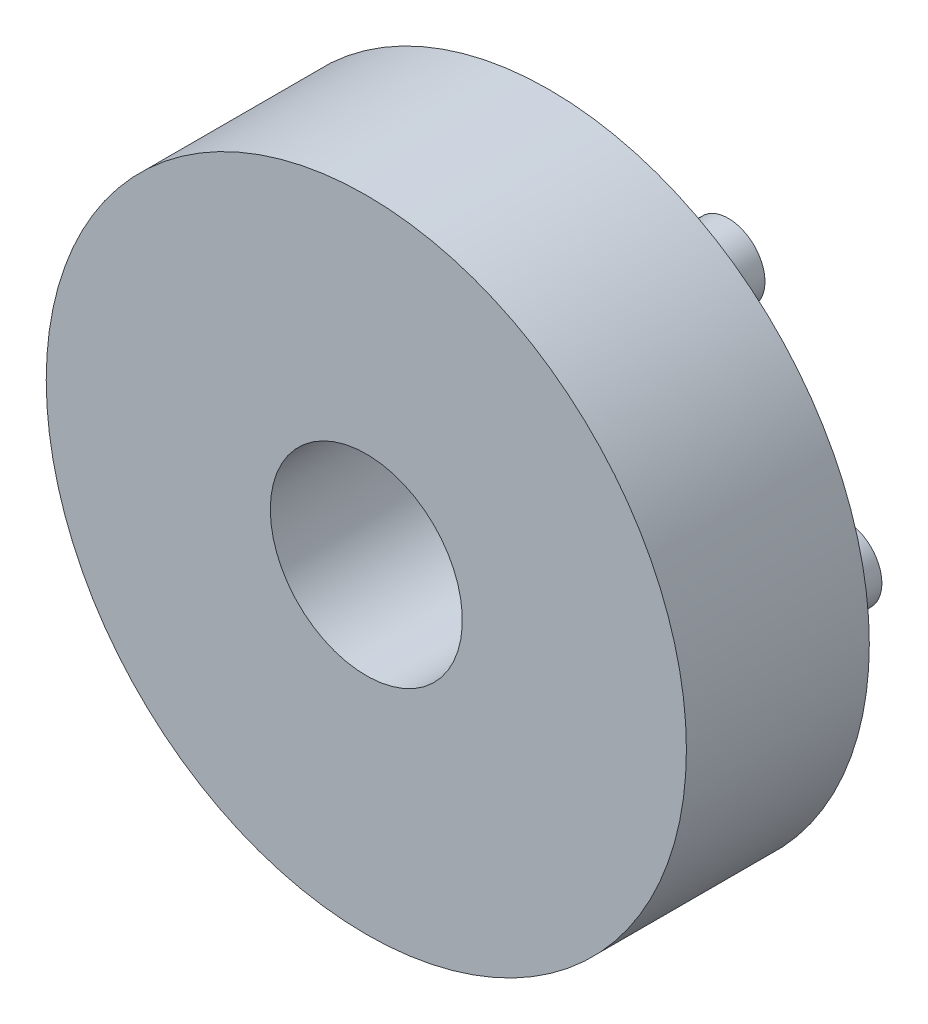
ISO-10303-21;
HEADER;
FILE_DESCRIPTION(('STEP AP214'),'2;1');
FILE_NAME('part.step','',(''),(''),'','','');
FILE_SCHEMA(('AUTOMOTIVE_DESIGN { 1 0 10303 214 1 1 1 1 }'));
ENDSEC;
DATA;
#1=APPLICATION_CONTEXT('core data for automotive mechanical design processes');
#2=APPLICATION_PROTOCOL_DEFINITION('international standard','automotive_design',2000,#1);
#3=PRODUCT_CONTEXT('',#1,'mechanical');
#4=PRODUCT('Part','Part','',(#3));
#5=PRODUCT_RELATED_PRODUCT_CATEGORY('part','',(#4));
#6=PRODUCT_DEFINITION_FORMATION('','',#4);
#7=PRODUCT_DEFINITION_CONTEXT('part definition',#1,'design');
#8=PRODUCT_DEFINITION('design','',#6,#7);
#9=PRODUCT_DEFINITION_SHAPE('','',#8);
#10=(LENGTH_UNIT() NAMED_UNIT(*) SI_UNIT(.MILLI.,.METRE.));
#11=(NAMED_UNIT(*) PLANE_ANGLE_UNIT() SI_UNIT($,.RADIAN.));
#12=(NAMED_UNIT(*) SI_UNIT($,.STERADIAN.) SOLID_ANGLE_UNIT());
#13=UNCERTAINTY_MEASURE_WITH_UNIT(LENGTH_MEASURE(1.E-05),#10,'distance_accuracy_value','');
#14=(GEOMETRIC_REPRESENTATION_CONTEXT(3) GLOBAL_UNCERTAINTY_ASSIGNED_CONTEXT((#13)) GLOBAL_UNIT_ASSIGNED_CONTEXT((#10,
#11,#12)) REPRESENTATION_CONTEXT('',''));
#15=CARTESIAN_POINT('',(0.,0.,0.));
#16=DIRECTION('',(0.,0.,1.));
#17=DIRECTION('',(1.,0.,0.));
#18=AXIS2_PLACEMENT_3D('',#15,#16,#17);
#19=CARTESIAN_POINT('',(0.,0.,0.));
#20=DIRECTION('',(0.,0.,1.));
#21=DIRECTION('',(1.,0.,0.));
#22=AXIS2_PLACEMENT_3D('',#19,#20,#21);
#23=PLANE('',#22);
#24=CARTESIAN_POINT('',(12.8293385803761,-23.0417841378882,0.));
#25=DIRECTION('',(0.,0.,-1.));
#26=DIRECTION('',(-1.,0.,0.));
#27=AXIS2_PLACEMENT_3D('',#24,#25,#26);
#28=CIRCLE('',#27,4.00000000000001);
#29=CARTESIAN_POINT('',(8.8293385803761,-23.0417841378882,0.));
#30=VERTEX_POINT('',#29);
#31=EDGE_CURVE('E60',#30,#30,#28,.T.);
#32=ORIENTED_EDGE('',*,*,#31,.F.);
#33=EDGE_LOOP('',(#32));
#34=FACE_BOUND('',#33,.T.);
#35=CARTESIAN_POINT('',(-26.3690966091135,0.431843358408401,0.));
#36=DIRECTION('',(0.,0.,-1.));
#37=DIRECTION('',(-1.,0.,0.));
#38=AXIS2_PLACEMENT_3D('',#35,#36,#37);
#39=CIRCLE('',#38,4.);
#40=CARTESIAN_POINT('',(-30.3690966091135,0.431843358408401,0.));
#41=VERTEX_POINT('',#40);
#42=EDGE_CURVE('E59',#41,#41,#39,.T.);
#43=ORIENTED_EDGE('',*,*,#42,.F.);
#44=EDGE_LOOP('',(#43));
#45=FACE_BOUND('',#44,.T.);
#46=CARTESIAN_POINT('',(13.5889936084931,22.6021016141264,0.));
#47=DIRECTION('',(0.,0.,-1.));
#48=DIRECTION('',(-1.,0.,0.));
#49=AXIS2_PLACEMENT_3D('',#46,#47,#48);
#50=CIRCLE('',#49,4.);
#51=CARTESIAN_POINT('',(9.58899360849312,22.6021016141264,0.));
#52=VERTEX_POINT('',#51);
#53=EDGE_CURVE('E54',#52,#52,#50,.T.);
#54=ORIENTED_EDGE('',*,*,#53,.F.);
#55=EDGE_LOOP('',(#54));
#56=FACE_BOUND('',#55,.T.);
#57=CARTESIAN_POINT('',(0.,0.,0.));
#58=DIRECTION('',(0.,0.,1.));
#59=DIRECTION('',(1.,0.,0.));
#60=AXIS2_PLACEMENT_3D('',#57,#58,#59);
#61=CIRCLE('',#60,35.);
#62=CARTESIAN_POINT('',(35.,0.,0.));
#63=VERTEX_POINT('',#62);
#64=EDGE_CURVE('E45',#63,#63,#61,.T.);
#65=ORIENTED_EDGE('',*,*,#64,.F.);
#66=EDGE_LOOP('',(#65));
#67=FACE_BOUND('',#66,.T.);
#68=CARTESIAN_POINT('',(-13.5889936084931,22.6021016141264,0.));
#69=DIRECTION('',(0.,0.,1.));
#70=DIRECTION('',(1.,0.,0.));
#71=AXIS2_PLACEMENT_3D('',#68,#69,#70);
#72=CIRCLE('',#71,4.);
#73=CARTESIAN_POINT('',(-9.58899360849312,22.6021016141264,0.));
#74=VERTEX_POINT('',#73);
#75=EDGE_CURVE('E71',#74,#74,#72,.T.);
#76=ORIENTED_EDGE('',*,*,#75,.T.);
#77=EDGE_LOOP('',(#76));
#78=FACE_BOUND('',#77,.T.);
#79=CARTESIAN_POINT('',(-12.8416013543717,-23.0349521232922,0.));
#80=DIRECTION('',(0.,0.,1.));
#81=DIRECTION('',(1.,0.,0.));
#82=AXIS2_PLACEMENT_3D('',#79,#80,#81);
#83=CIRCLE('',#82,4.00000000000001);
#84=CARTESIAN_POINT('',(-8.84160135437169,-23.0349521232922,0.));
#85=VERTEX_POINT('',#84);
#86=EDGE_CURVE('E83',#85,#85,#83,.T.);
#87=ORIENTED_EDGE('',*,*,#86,.T.);
#88=EDGE_LOOP('',(#87));
#89=FACE_BOUND('',#88,.T.);
#90=CARTESIAN_POINT('',(26.3690966091135,0.431843358408401,0.));
#91=DIRECTION('',(0.,0.,1.));
#92=DIRECTION('',(1.,0.,0.));
#93=AXIS2_PLACEMENT_3D('',#90,#91,#92);
#94=CIRCLE('',#93,4.);
#95=CARTESIAN_POINT('',(30.3690966091135,0.431843358408401,0.));
#96=VERTEX_POINT('',#95);
#97=EDGE_CURVE('E95',#96,#96,#94,.T.);
#98=ORIENTED_EDGE('',*,*,#97,.T.);
#99=EDGE_LOOP('',(#98));
#100=FACE_BOUND('',#99,.T.);
#101=CARTESIAN_POINT('',(0.,0.,0.));
#102=DIRECTION('',(0.,0.,-1.));
#103=DIRECTION('',(-1.,0.,0.));
#104=AXIS2_PLACEMENT_3D('',#101,#102,#103);
#105=CIRCLE('',#104,10.5);
#106=CARTESIAN_POINT('',(-10.5,0.,0.));
#107=VERTEX_POINT('',#106);
#108=EDGE_CURVE('E104',#107,#107,#105,.T.);
#109=ORIENTED_EDGE('',*,*,#108,.F.);
#110=EDGE_LOOP('',(#109));
#111=FACE_BOUND('',#110,.T.);
#112=ADVANCED_FACE('F41',(#34,#45,#56,#67,#78,#89,#100,#111),#23,.F.);
#113=CARTESIAN_POINT('',(0.,0.,20.));
#114=DIRECTION('',(0.,0.,1.));
#115=DIRECTION('',(1.,0.,0.));
#116=AXIS2_PLACEMENT_3D('',#113,#114,#115);
#117=PLANE('',#116);
#118=CARTESIAN_POINT('',(0.,0.,20.));
#119=DIRECTION('',(0.,0.,1.));
#120=DIRECTION('',(1.,0.,0.));
#121=AXIS2_PLACEMENT_3D('',#118,#119,#120);
#122=CIRCLE('',#121,35.);
#123=CARTESIAN_POINT('',(35.,0.,20.));
#124=VERTEX_POINT('',#123);
#125=EDGE_CURVE('E10',#124,#124,#122,.T.);
#126=ORIENTED_EDGE('',*,*,#125,.T.);
#127=EDGE_LOOP('',(#126));
#128=FACE_BOUND('',#127,.T.);
#129=CARTESIAN_POINT('',(0.,0.,20.));
#130=DIRECTION('',(0.,0.,-1.));
#131=DIRECTION('',(-1.,0.,0.));
#132=AXIS2_PLACEMENT_3D('',#129,#130,#131);
#133=CIRCLE('',#132,10.5);
#134=CARTESIAN_POINT('',(-10.5,0.,20.));
#135=VERTEX_POINT('',#134);
#136=EDGE_CURVE('E103',#135,#135,#133,.T.);
#137=ORIENTED_EDGE('',*,*,#136,.T.);
#138=EDGE_LOOP('',(#137));
#139=FACE_BOUND('',#138,.T.);
#140=ADVANCED_FACE('F112',(#128,#139),#117,.T.);
#141=CARTESIAN_POINT('',(0.,0.,20.));
#142=DIRECTION('',(0.,0.,-1.));
#143=DIRECTION('',(-1.,0.,0.));
#144=AXIS2_PLACEMENT_3D('',#141,#142,#143);
#145=CYLINDRICAL_SURFACE('',#144,35.);
#146=ORIENTED_EDGE('',*,*,#125,.F.);
#147=EDGE_LOOP('',(#146));
#148=FACE_BOUND('',#147,.T.);
#149=ORIENTED_EDGE('',*,*,#64,.T.);
#150=EDGE_LOOP('',(#149));
#151=FACE_BOUND('',#150,.T.);
#152=ADVANCED_FACE('F43',(#148,#151),#145,.T.);
#153=CARTESIAN_POINT('',(13.5889936084931,22.6021016141264,9.));
#154=DIRECTION('',(0.,0.,-1.));
#155=DIRECTION('',(-1.,0.,0.));
#156=AXIS2_PLACEMENT_3D('',#153,#154,#155);
#157=CYLINDRICAL_SURFACE('',#156,4.);
#158=CARTESIAN_POINT('',(13.5889936084931,22.6021016141264,-6.));
#159=DIRECTION('',(0.,0.,-1.));
#160=DIRECTION('',(-1.,0.,0.));
#161=AXIS2_PLACEMENT_3D('',#158,#159,#160);
#162=CIRCLE('',#161,4.);
#163=CARTESIAN_POINT('',(9.58899360849312,22.6021016141264,-6.));
#164=VERTEX_POINT('',#163);
#165=EDGE_CURVE('E64',#164,#164,#162,.T.);
#166=ORIENTED_EDGE('',*,*,#165,.F.);
#167=EDGE_LOOP('',(#166));
#168=FACE_BOUND('',#167,.T.);
#169=ORIENTED_EDGE('',*,*,#53,.T.);
#170=EDGE_LOOP('',(#169));
#171=FACE_BOUND('',#170,.T.);
#172=ADVANCED_FACE('F131',(#168,#171),#157,.T.);
#173=CARTESIAN_POINT('',(13.5889936084931,22.6021016141264,-6.));
#174=DIRECTION('',(0.,0.,-1.));
#175=DIRECTION('',(-1.,0.,0.));
#176=AXIS2_PLACEMENT_3D('',#173,#174,#175);
#177=PLANE('',#176);
#178=ORIENTED_EDGE('',*,*,#165,.T.);
#179=EDGE_LOOP('',(#178));
#180=FACE_BOUND('',#179,.T.);
#181=ADVANCED_FACE('F134',(#180),#177,.T.);
#182=CARTESIAN_POINT('',(-13.5889936084931,22.6021016141264,9.));
#183=DIRECTION('',(0.,0.,-1.));
#184=DIRECTION('',(-1.,0.,0.));
#185=AXIS2_PLACEMENT_3D('',#182,#183,#184);
#186=CYLINDRICAL_SURFACE('',#185,4.);
#187=CARTESIAN_POINT('',(-13.5889936084931,22.6021016141264,-6.));
#188=DIRECTION('',(0.,0.,-1.));
#189=DIRECTION('',(-1.,0.,0.));
#190=AXIS2_PLACEMENT_3D('',#187,#188,#189);
#191=CIRCLE('',#190,4.);
#192=CARTESIAN_POINT('',(-17.5889936084931,22.6021016141264,-6.));
#193=VERTEX_POINT('',#192);
#194=EDGE_CURVE('E75',#193,#193,#191,.T.);
#195=ORIENTED_EDGE('',*,*,#194,.F.);
#196=EDGE_LOOP('',(#195));
#197=FACE_BOUND('',#196,.T.);
#198=ORIENTED_EDGE('',*,*,#75,.F.);
#199=EDGE_LOOP('',(#198));
#200=FACE_BOUND('',#199,.T.);
#201=ADVANCED_FACE('F138',(#197,#200),#186,.T.);
#202=CARTESIAN_POINT('',(-13.5889936084931,22.6021016141264,-6.));
#203=DIRECTION('',(0.,0.,-1.));
#204=DIRECTION('',(-1.,0.,0.));
#205=AXIS2_PLACEMENT_3D('',#202,#203,#204);
#206=PLANE('',#205);
#207=ORIENTED_EDGE('',*,*,#194,.T.);
#208=EDGE_LOOP('',(#207));
#209=FACE_BOUND('',#208,.T.);
#210=ADVANCED_FACE('F140',(#209),#206,.T.);
#211=CARTESIAN_POINT('',(-26.3690966091135,0.431843358408401,9.));
#212=DIRECTION('',(0.,0.,-1.));
#213=DIRECTION('',(-1.,0.,0.));
#214=AXIS2_PLACEMENT_3D('',#211,#212,#213);
#215=CYLINDRICAL_SURFACE('',#214,4.);
#216=CARTESIAN_POINT('',(-26.3690966091135,0.431843358408401,-6.));
#217=DIRECTION('',(0.,0.,-1.));
#218=DIRECTION('',(-1.,0.,0.));
#219=AXIS2_PLACEMENT_3D('',#216,#217,#218);
#220=CIRCLE('',#219,4.);
#221=CARTESIAN_POINT('',(-30.3690966091135,0.431843358408401,-6.));
#222=VERTEX_POINT('',#221);
#223=EDGE_CURVE('E79',#222,#222,#220,.T.);
#224=ORIENTED_EDGE('',*,*,#223,.F.);
#225=EDGE_LOOP('',(#224));
#226=FACE_BOUND('',#225,.T.);
#227=ORIENTED_EDGE('',*,*,#42,.T.);
#228=EDGE_LOOP('',(#227));
#229=FACE_BOUND('',#228,.T.);
#230=ADVANCED_FACE('F143',(#226,#229),#215,.T.);
#231=CARTESIAN_POINT('',(-26.3690966091135,0.431843358408401,-6.));
#232=DIRECTION('',(0.,0.,-1.));
#233=DIRECTION('',(-1.,0.,0.));
#234=AXIS2_PLACEMENT_3D('',#231,#232,#233);
#235=PLANE('',#234);
#236=ORIENTED_EDGE('',*,*,#223,.T.);
#237=EDGE_LOOP('',(#236));
#238=FACE_BOUND('',#237,.T.);
#239=ADVANCED_FACE('F148',(#238),#235,.T.);
#240=CARTESIAN_POINT('',(-12.8416013543717,-23.0349521232922,9.));
#241=DIRECTION('',(0.,0.,-1.));
#242=DIRECTION('',(-1.,0.,0.));
#243=AXIS2_PLACEMENT_3D('',#240,#241,#242);
#244=CYLINDRICAL_SURFACE('',#243,4.00000000000001);
#245=CARTESIAN_POINT('',(-12.8416013543717,-23.0349521232922,-6.));
#246=DIRECTION('',(0.,0.,-1.));
#247=DIRECTION('',(-1.,0.,0.));
#248=AXIS2_PLACEMENT_3D('',#245,#246,#247);
#249=CIRCLE('',#248,4.00000000000001);
#250=CARTESIAN_POINT('',(-16.8416013543717,-23.0349521232922,-6.));
#251=VERTEX_POINT('',#250);
#252=EDGE_CURVE('E87',#251,#251,#249,.T.);
#253=ORIENTED_EDGE('',*,*,#252,.F.);
#254=EDGE_LOOP('',(#253));
#255=FACE_BOUND('',#254,.T.);
#256=ORIENTED_EDGE('',*,*,#86,.F.);
#257=EDGE_LOOP('',(#256));
#258=FACE_BOUND('',#257,.T.);
#259=ADVANCED_FACE('F151',(#255,#258),#244,.T.);
#260=CARTESIAN_POINT('',(-12.8416013543717,-23.0349521232922,-6.));
#261=DIRECTION('',(0.,0.,-1.));
#262=DIRECTION('',(-1.,0.,0.));
#263=AXIS2_PLACEMENT_3D('',#260,#261,#262);
#264=PLANE('',#263);
#265=ORIENTED_EDGE('',*,*,#252,.T.);
#266=EDGE_LOOP('',(#265));
#267=FACE_BOUND('',#266,.T.);
#268=ADVANCED_FACE('F156',(#267),#264,.T.);
#269=CARTESIAN_POINT('',(12.8293385803761,-23.0417841378882,9.));
#270=DIRECTION('',(0.,0.,-1.));
#271=DIRECTION('',(-1.,0.,0.));
#272=AXIS2_PLACEMENT_3D('',#269,#270,#271);
#273=CYLINDRICAL_SURFACE('',#272,4.00000000000001);
#274=CARTESIAN_POINT('',(12.8293385803761,-23.0417841378882,-6.));
#275=DIRECTION('',(0.,0.,-1.));
#276=DIRECTION('',(-1.,0.,0.));
#277=AXIS2_PLACEMENT_3D('',#274,#275,#276);
#278=CIRCLE('',#277,4.00000000000001);
#279=CARTESIAN_POINT('',(8.8293385803761,-23.0417841378882,-6.));
#280=VERTEX_POINT('',#279);
#281=EDGE_CURVE('E91',#280,#280,#278,.T.);
#282=ORIENTED_EDGE('',*,*,#281,.F.);
#283=EDGE_LOOP('',(#282));
#284=FACE_BOUND('',#283,.T.);
#285=ORIENTED_EDGE('',*,*,#31,.T.);
#286=EDGE_LOOP('',(#285));
#287=FACE_BOUND('',#286,.T.);
#288=ADVANCED_FACE('F159',(#284,#287),#273,.T.);
#289=CARTESIAN_POINT('',(12.8293385803761,-23.0417841378882,-6.));
#290=DIRECTION('',(0.,0.,-1.));
#291=DIRECTION('',(-1.,0.,0.));
#292=AXIS2_PLACEMENT_3D('',#289,#290,#291);
#293=PLANE('',#292);
#294=ORIENTED_EDGE('',*,*,#281,.T.);
#295=EDGE_LOOP('',(#294));
#296=FACE_BOUND('',#295,.T.);
#297=ADVANCED_FACE('F164',(#296),#293,.T.);
#298=CARTESIAN_POINT('',(26.3690966091135,0.431843358408401,9.));
#299=DIRECTION('',(0.,0.,-1.));
#300=DIRECTION('',(-1.,0.,0.));
#301=AXIS2_PLACEMENT_3D('',#298,#299,#300);
#302=CYLINDRICAL_SURFACE('',#301,4.);
#303=CARTESIAN_POINT('',(26.3690966091135,0.431843358408401,-6.));
#304=DIRECTION('',(0.,0.,-1.));
#305=DIRECTION('',(-1.,0.,0.));
#306=AXIS2_PLACEMENT_3D('',#303,#304,#305);
#307=CIRCLE('',#306,4.);
#308=CARTESIAN_POINT('',(22.3690966091135,0.431843358408401,-6.));
#309=VERTEX_POINT('',#308);
#310=EDGE_CURVE('E99',#309,#309,#307,.T.);
#311=ORIENTED_EDGE('',*,*,#310,.F.);
#312=EDGE_LOOP('',(#311));
#313=FACE_BOUND('',#312,.T.);
#314=ORIENTED_EDGE('',*,*,#97,.F.);
#315=EDGE_LOOP('',(#314));
#316=FACE_BOUND('',#315,.T.);
#317=ADVANCED_FACE('F167',(#313,#316),#302,.T.);
#318=CARTESIAN_POINT('',(26.3690966091135,0.431843358408401,-6.));
#319=DIRECTION('',(0.,0.,-1.));
#320=DIRECTION('',(-1.,0.,0.));
#321=AXIS2_PLACEMENT_3D('',#318,#319,#320);
#322=PLANE('',#321);
#323=ORIENTED_EDGE('',*,*,#310,.T.);
#324=EDGE_LOOP('',(#323));
#325=FACE_BOUND('',#324,.T.);
#326=ADVANCED_FACE('F117',(#325),#322,.T.);
#327=CARTESIAN_POINT('',(0.,0.,20.));
#328=DIRECTION('',(0.,0.,-1.));
#329=DIRECTION('',(-1.,0.,0.));
#330=AXIS2_PLACEMENT_3D('',#327,#328,#329);
#331=CYLINDRICAL_SURFACE('',#330,10.5);
#332=ORIENTED_EDGE('',*,*,#136,.F.);
#333=EDGE_LOOP('',(#332));
#334=FACE_BOUND('',#333,.T.);
#335=ORIENTED_EDGE('',*,*,#108,.T.);
#336=EDGE_LOOP('',(#335));
#337=FACE_BOUND('',#336,.T.);
#338=ADVANCED_FACE('F114',(#334,#337),#331,.F.);
#339=CLOSED_SHELL('',(#112,#140,#152,#172,#181,#201,#210,#230,#239,#259,#268,#288,#297,#317,
#326,#338));
#340=MANIFOLD_SOLID_BREP('B2',#339);
#341=ADVANCED_BREP_SHAPE_REPRESENTATION('',(#18,#340),#14);
#342=SHAPE_DEFINITION_REPRESENTATION(#9,#341);
ENDSEC;
END-ISO-10303-21;
